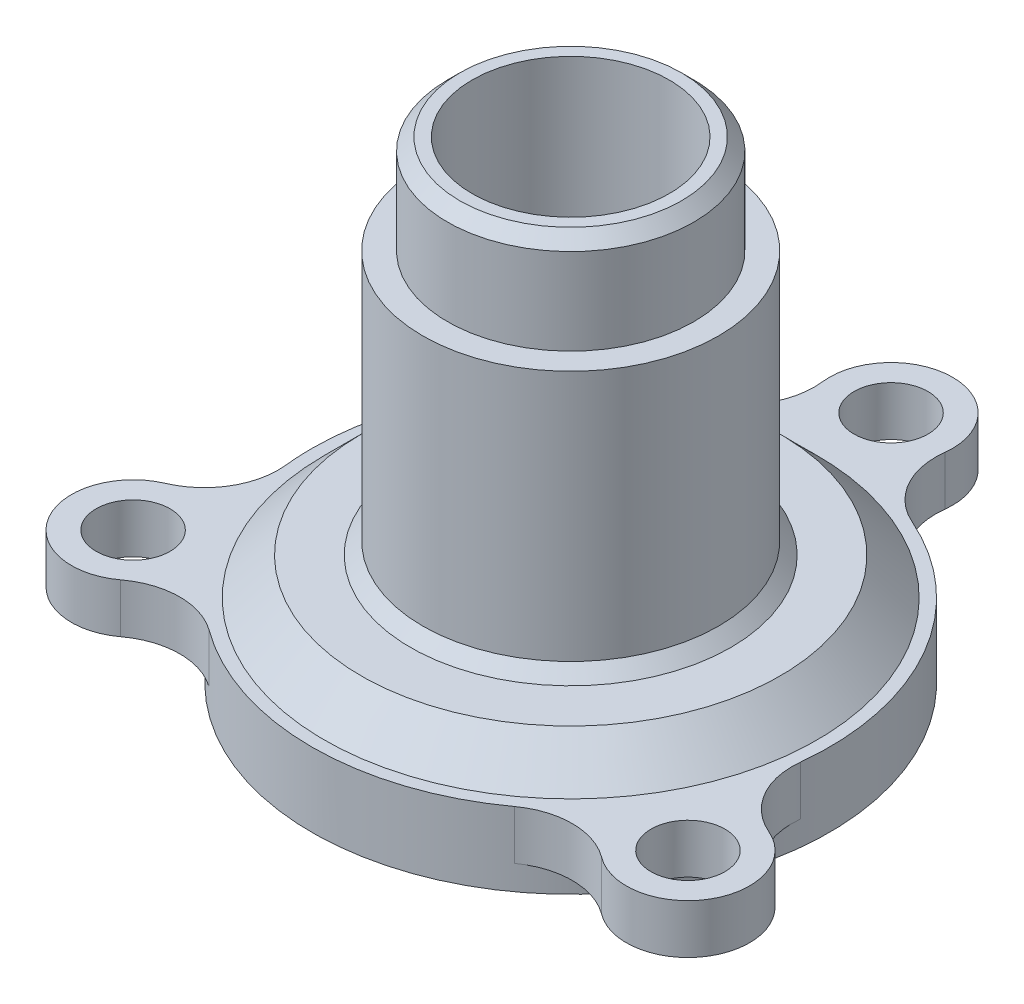
ISO-10303-21;
HEADER;
FILE_DESCRIPTION(('STEP AP214'),'2;1');
FILE_NAME('part.step','',(''),(''),'','','');
FILE_SCHEMA(('AUTOMOTIVE_DESIGN { 1 0 10303 214 1 1 1 1 }'));
ENDSEC;
DATA;
#1=APPLICATION_CONTEXT('core data for automotive mechanical design processes');
#2=APPLICATION_PROTOCOL_DEFINITION('international standard','automotive_design',2000,#1);
#3=PRODUCT_CONTEXT('',#1,'mechanical');
#4=PRODUCT('Part','Part','',(#3));
#5=PRODUCT_RELATED_PRODUCT_CATEGORY('part','',(#4));
#6=PRODUCT_DEFINITION_FORMATION('','',#4);
#7=PRODUCT_DEFINITION_CONTEXT('part definition',#1,'design');
#8=PRODUCT_DEFINITION('design','',#6,#7);
#9=PRODUCT_DEFINITION_SHAPE('','',#8);
#10=(LENGTH_UNIT() NAMED_UNIT(*) SI_UNIT(.MILLI.,.METRE.));
#11=(NAMED_UNIT(*) PLANE_ANGLE_UNIT() SI_UNIT($,.RADIAN.));
#12=(NAMED_UNIT(*) SI_UNIT($,.STERADIAN.) SOLID_ANGLE_UNIT());
#13=UNCERTAINTY_MEASURE_WITH_UNIT(LENGTH_MEASURE(1.E-05),#10,'distance_accuracy_value','');
#14=(GEOMETRIC_REPRESENTATION_CONTEXT(3) GLOBAL_UNCERTAINTY_ASSIGNED_CONTEXT((#13)) GLOBAL_UNIT_ASSIGNED_CONTEXT((#10,
#11,#12)) REPRESENTATION_CONTEXT('',''));
#15=CARTESIAN_POINT('',(0.,0.,0.));
#16=DIRECTION('',(0.,0.,1.));
#17=DIRECTION('',(1.,0.,0.));
#18=AXIS2_PLACEMENT_3D('',#15,#16,#17);
#19=CARTESIAN_POINT('',(0.,0.,0.));
#20=DIRECTION('',(0.,1.,0.));
#21=DIRECTION('',(-1.,0.,0.));
#22=AXIS2_PLACEMENT_3D('',#19,#20,#21);
#23=PLANE('',#22);
#24=CARTESIAN_POINT('',(-11.2583302491977,0.,6.50000000000001));
#25=DIRECTION('',(0.,1.,0.));
#26=DIRECTION('',(-1.,0.,0.));
#27=AXIS2_PLACEMENT_3D('',#24,#25,#26);
#28=CIRCLE('',#27,1.5);
#29=CARTESIAN_POINT('',(-12.7583302491977,0.,6.50000000000001));
#30=VERTEX_POINT('',#29);
#31=EDGE_CURVE('E464',#30,#30,#28,.T.);
#32=ORIENTED_EDGE('',*,*,#31,.T.);
#33=EDGE_LOOP('',(#32));
#34=FACE_BOUND('',#33,.T.);
#35=CARTESIAN_POINT('',(-7.96158450836959,0.,10.9024388150583));
#36=DIRECTION('',(0.,1.,0.));
#37=DIRECTION('',(-1.,0.,0.));
#38=AXIS2_PLACEMENT_3D('',#35,#36,#37);
#39=CIRCLE('',#38,3.);
#40=CARTESIAN_POINT('',(-6.19234350650969,0.,8.47967463393422));
#41=VERTEX_POINT('',#40);
#42=CARTESIAN_POINT('',(-9.7598094579122,0.,8.50110855229923));
#43=VERTEX_POINT('',#42);
#44=EDGE_CURVE('E370',#41,#43,#39,.T.);
#45=ORIENTED_EDGE('',*,*,#44,.T.);
#46=CARTESIAN_POINT('',(-11.2583302491977,0.,6.50000000000001));
#47=DIRECTION('',(0.,1.,0.));
#48=DIRECTION('',(-1.,0.,0.));
#49=AXIS2_PLACEMENT_3D('',#46,#47,#48);
#50=CIRCLE('',#49,2.5);
#51=CARTESIAN_POINT('',(-12.2420806955764,0.,4.201688650498));
#52=VERTEX_POINT('',#51);
#53=EDGE_CURVE('E458',#52,#43,#50,.T.);
#54=ORIENTED_EDGE('',*,*,#53,.F.);
#55=CARTESIAN_POINT('',(-13.4225812312308,0.,1.44371503109558));
#56=DIRECTION('',(0.,1.,0.));
#57=DIRECTION('',(-1.,0.,0.));
#58=AXIS2_PLACEMENT_3D('',#55,#56,#57);
#59=CIRCLE('',#58,3.);
#60=CARTESIAN_POINT('',(-10.4397854020684,0.,1.12288946862988));
#61=VERTEX_POINT('',#60);
#62=EDGE_CURVE('E291',#61,#52,#59,.F.);
#63=ORIENTED_EDGE('',*,*,#62,.F.);
#64=CARTESIAN_POINT('',(0.,0.,0.));
#65=DIRECTION('',(0.,1.,0.));
#66=DIRECTION('',(-1.,0.,0.));
#67=AXIS2_PLACEMENT_3D('',#64,#65,#66);
#68=CIRCLE('',#67,10.5);
#69=EDGE_CURVE('E489',#61,#41,#68,.T.);
#70=ORIENTED_EDGE('',*,*,#69,.T.);
#71=EDGE_LOOP('',(#45,#54,#63,#70));
#72=FACE_BOUND('',#71,.T.);
#73=ADVANCED_FACE('F271',(#34,#72),#23,.F.);
#74=CARTESIAN_POINT('',(11.2583302491977,0.,6.5));
#75=DIRECTION('',(0.,1.,0.));
#76=DIRECTION('',(-1.,0.,0.));
#77=AXIS2_PLACEMENT_3D('',#74,#75,#76);
#78=CIRCLE('',#77,1.5);
#79=CARTESIAN_POINT('',(9.75833024919771,0.,6.5));
#80=VERTEX_POINT('',#79);
#81=EDGE_CURVE('E467',#80,#80,#78,.T.);
#82=ORIENTED_EDGE('',*,*,#81,.T.);
#83=EDGE_LOOP('',(#82));
#84=FACE_BOUND('',#83,.T.);
#85=CARTESIAN_POINT('',(7.9615845083696,0.,10.9024388150583));
#86=DIRECTION('',(0.,1.,0.));
#87=DIRECTION('',(-1.,0.,0.));
#88=AXIS2_PLACEMENT_3D('',#85,#86,#87);
#89=CIRCLE('',#88,3.);
#90=CARTESIAN_POINT('',(6.19234350650969,0.,8.47967463393422));
#91=VERTEX_POINT('',#90);
#92=CARTESIAN_POINT('',(9.75980945791221,0.,8.50110855229922));
#93=VERTEX_POINT('',#92);
#94=EDGE_CURVE('E379',#91,#93,#89,.F.);
#95=ORIENTED_EDGE('',*,*,#94,.F.);
#96=CARTESIAN_POINT('',(10.4397854020684,0.,1.12288946862989));
#97=VERTEX_POINT('',#96);
#98=EDGE_CURVE('E493',#91,#97,#68,.T.);
#99=ORIENTED_EDGE('',*,*,#98,.T.);
#100=CARTESIAN_POINT('',(13.4225812312308,0.,1.44371503109557));
#101=DIRECTION('',(0.,1.,0.));
#102=DIRECTION('',(-1.,0.,0.));
#103=AXIS2_PLACEMENT_3D('',#100,#101,#102);
#104=CIRCLE('',#103,3.);
#105=CARTESIAN_POINT('',(12.2420806955764,0.,4.20168865049799));
#106=VERTEX_POINT('',#105);
#107=EDGE_CURVE('E419',#97,#106,#104,.T.);
#108=ORIENTED_EDGE('',*,*,#107,.T.);
#109=CARTESIAN_POINT('',(11.2583302491977,0.,6.5));
#110=DIRECTION('',(0.,1.,0.));
#111=DIRECTION('',(-1.,0.,0.));
#112=AXIS2_PLACEMENT_3D('',#109,#110,#111);
#113=CIRCLE('',#112,2.5);
#114=EDGE_CURVE('E422',#93,#106,#113,.T.);
#115=ORIENTED_EDGE('',*,*,#114,.F.);
#116=EDGE_LOOP('',(#95,#99,#108,#115));
#117=FACE_BOUND('',#116,.T.);
#118=ADVANCED_FACE('F530',(#84,#117),#23,.F.);
#119=CARTESIAN_POINT('',(0.,2.,0.));
#120=DIRECTION('',(0.,-1.,0.));
#121=DIRECTION('',(1.,0.,0.));
#122=AXIS2_PLACEMENT_3D('',#119,#120,#121);
#123=PLANE('',#122);
#124=CARTESIAN_POINT('',(11.2583302491977,2.,6.5));
#125=DIRECTION('',(0.,1.,0.));
#126=DIRECTION('',(0.,0.,1.));
#127=AXIS2_PLACEMENT_3D('',#124,#125,#126);
#128=CIRCLE('',#127,1.5);
#129=CARTESIAN_POINT('',(11.2583302491977,2.,8.));
#130=VERTEX_POINT('',#129);
#131=EDGE_CURVE('E424',#130,#130,#128,.T.);
#132=ORIENTED_EDGE('',*,*,#131,.F.);
#133=EDGE_LOOP('',(#132));
#134=FACE_BOUND('',#133,.T.);
#135=CARTESIAN_POINT('',(-11.2583302491977,2.,6.50000000000001));
#136=DIRECTION('',(0.,1.,0.));
#137=DIRECTION('',(0.,0.,1.));
#138=AXIS2_PLACEMENT_3D('',#135,#136,#137);
#139=CIRCLE('',#138,1.5);
#140=CARTESIAN_POINT('',(-11.2583302491977,2.,8.00000000000001));
#141=VERTEX_POINT('',#140);
#142=EDGE_CURVE('E428',#141,#141,#139,.T.);
#143=ORIENTED_EDGE('',*,*,#142,.F.);
#144=EDGE_LOOP('',(#143));
#145=FACE_BOUND('',#144,.T.);
#146=CARTESIAN_POINT('',(0.,2.,-13.));
#147=DIRECTION('',(0.,1.,0.));
#148=DIRECTION('',(0.,0.,1.));
#149=AXIS2_PLACEMENT_3D('',#146,#147,#148);
#150=CIRCLE('',#149,1.5);
#151=CARTESIAN_POINT('',(0.,2.,-11.5));
#152=VERTEX_POINT('',#151);
#153=EDGE_CURVE('E425',#152,#152,#150,.T.);
#154=ORIENTED_EDGE('',*,*,#153,.F.);
#155=EDGE_LOOP('',(#154));
#156=FACE_BOUND('',#155,.T.);
#157=CARTESIAN_POINT('',(0.,2.,0.));
#158=DIRECTION('',(0.,1.,0.));
#159=DIRECTION('',(-1.,0.,0.));
#160=AXIS2_PLACEMENT_3D('',#157,#158,#159);
#161=CIRCLE('',#160,10.);
#162=CARTESIAN_POINT('',(-10.,2.,0.));
#163=VERTEX_POINT('',#162);
#164=EDGE_CURVE('E485',#163,#163,#161,.T.);
#165=ORIENTED_EDGE('',*,*,#164,.F.);
#166=EDGE_LOOP('',(#165));
#167=FACE_BOUND('',#166,.T.);
#168=CARTESIAN_POINT('',(-11.2583302491977,2.,6.50000000000001));
#169=DIRECTION('',(0.,1.,0.));
#170=DIRECTION('',(0.,0.,1.));
#171=AXIS2_PLACEMENT_3D('',#168,#169,#170);
#172=CIRCLE('',#171,2.5);
#173=CARTESIAN_POINT('',(-12.2420806955764,2.,4.201688650498));
#174=VERTEX_POINT('',#173);
#175=CARTESIAN_POINT('',(-9.7598094579122,2.,8.50110855229923));
#176=VERTEX_POINT('',#175);
#177=EDGE_CURVE('E443',#174,#176,#172,.T.);
#178=ORIENTED_EDGE('',*,*,#177,.T.);
#179=CARTESIAN_POINT('',(-7.96158450836959,2.,10.9024388150583));
#180=DIRECTION('',(0.,1.,0.));
#181=DIRECTION('',(0.,0.,1.));
#182=AXIS2_PLACEMENT_3D('',#179,#180,#181);
#183=CIRCLE('',#182,3.);
#184=CARTESIAN_POINT('',(-6.19234350650969,2.,8.47967463393422));
#185=VERTEX_POINT('',#184);
#186=EDGE_CURVE('E381',#185,#176,#183,.T.);
#187=ORIENTED_EDGE('',*,*,#186,.F.);
#188=CARTESIAN_POINT('',(0.,2.,0.));
#189=DIRECTION('',(0.,1.,0.));
#190=DIRECTION('',(0.,0.,1.));
#191=AXIS2_PLACEMENT_3D('',#188,#189,#190);
#192=CIRCLE('',#191,10.5);
#193=CARTESIAN_POINT('',(6.19234350650969,2.,8.47967463393422));
#194=VERTEX_POINT('',#193);
#195=EDGE_CURVE('E386',#185,#194,#192,.T.);
#196=ORIENTED_EDGE('',*,*,#195,.T.);
#197=CARTESIAN_POINT('',(7.9615845083696,2.,10.9024388150583));
#198=DIRECTION('',(0.,1.,0.));
#199=DIRECTION('',(0.,0.,1.));
#200=AXIS2_PLACEMENT_3D('',#197,#198,#199);
#201=CIRCLE('',#200,3.);
#202=CARTESIAN_POINT('',(9.75980945791221,2.,8.50110855229922));
#203=VERTEX_POINT('',#202);
#204=EDGE_CURVE('E376',#194,#203,#201,.F.);
#205=ORIENTED_EDGE('',*,*,#204,.T.);
#206=CARTESIAN_POINT('',(11.2583302491977,2.,6.5));
#207=DIRECTION('',(0.,1.,0.));
#208=DIRECTION('',(0.,0.,1.));
#209=AXIS2_PLACEMENT_3D('',#206,#207,#208);
#210=CIRCLE('',#209,2.5);
#211=CARTESIAN_POINT('',(12.2420806955764,2.,4.20168865049799));
#212=VERTEX_POINT('',#211);
#213=EDGE_CURVE('E359',#203,#212,#210,.T.);
#214=ORIENTED_EDGE('',*,*,#213,.T.);
#215=CARTESIAN_POINT('',(13.4225812312308,2.,1.44371503109557));
#216=DIRECTION('',(0.,1.,0.));
#217=DIRECTION('',(0.,0.,1.));
#218=AXIS2_PLACEMENT_3D('',#215,#216,#217);
#219=CIRCLE('',#218,3.);
#220=CARTESIAN_POINT('',(10.4397854020684,2.,1.12288946862989));
#221=VERTEX_POINT('',#220);
#222=EDGE_CURVE('E406',#221,#212,#219,.T.);
#223=ORIENTED_EDGE('',*,*,#222,.F.);
#224=CARTESIAN_POINT('',(0.,2.,0.));
#225=DIRECTION('',(0.,1.,0.));
#226=DIRECTION('',(0.,0.,1.));
#227=AXIS2_PLACEMENT_3D('',#224,#225,#226);
#228=CIRCLE('',#227,10.5);
#229=CARTESIAN_POINT('',(4.2474418955587,2.,-9.60256410256411));
#230=VERTEX_POINT('',#229);
#231=EDGE_CURVE('E403',#221,#230,#228,.T.);
#232=ORIENTED_EDGE('',*,*,#231,.T.);
#233=CARTESIAN_POINT('',(5.46099672286118,2.,-12.3461538461539));
#234=DIRECTION('',(0.,1.,0.));
#235=DIRECTION('',(0.,0.,1.));
#236=AXIS2_PLACEMENT_3D('',#233,#234,#235);
#237=CIRCLE('',#236,3.);
#238=CARTESIAN_POINT('',(2.48227123766417,2.,-12.7027972027972));
#239=VERTEX_POINT('',#238);
#240=EDGE_CURVE('E369',#230,#239,#237,.F.);
#241=ORIENTED_EDGE('',*,*,#240,.T.);
#242=CARTESIAN_POINT('',(0.,2.,-13.));
#243=DIRECTION('',(0.,1.,0.));
#244=DIRECTION('',(0.,0.,1.));
#245=AXIS2_PLACEMENT_3D('',#242,#243,#244);
#246=CIRCLE('',#245,2.5);
#247=CARTESIAN_POINT('',(-2.48227123766417,2.,-12.7027972027972));
#248=VERTEX_POINT('',#247);
#249=EDGE_CURVE('E440',#239,#248,#246,.T.);
#250=ORIENTED_EDGE('',*,*,#249,.T.);
#251=CARTESIAN_POINT('',(-5.46099672286118,2.,-12.3461538461539));
#252=DIRECTION('',(0.,1.,0.));
#253=DIRECTION('',(0.,0.,1.));
#254=AXIS2_PLACEMENT_3D('',#251,#252,#253);
#255=CIRCLE('',#254,3.);
#256=CARTESIAN_POINT('',(-4.2474418955587,2.,-9.60256410256411));
#257=VERTEX_POINT('',#256);
#258=EDGE_CURVE('E437',#257,#248,#255,.T.);
#259=ORIENTED_EDGE('',*,*,#258,.F.);
#260=CARTESIAN_POINT('',(0.,2.,0.));
#261=DIRECTION('',(0.,1.,0.));
#262=DIRECTION('',(0.,0.,1.));
#263=AXIS2_PLACEMENT_3D('',#260,#261,#262);
#264=CIRCLE('',#263,10.5);
#265=CARTESIAN_POINT('',(-10.4397854020684,2.,1.12288946862988));
#266=VERTEX_POINT('',#265);
#267=EDGE_CURVE('E434',#257,#266,#264,.T.);
#268=ORIENTED_EDGE('',*,*,#267,.T.);
#269=CARTESIAN_POINT('',(-13.4225812312308,2.,1.44371503109558));
#270=DIRECTION('',(0.,1.,0.));
#271=DIRECTION('',(0.,0.,1.));
#272=AXIS2_PLACEMENT_3D('',#269,#270,#271);
#273=CIRCLE('',#272,3.);
#274=EDGE_CURVE('E286',#266,#174,#273,.F.);
#275=ORIENTED_EDGE('',*,*,#274,.T.);
#276=EDGE_LOOP('',(#178,#187,#196,#205,#214,#223,#232,#241,#250,#259,#268,#275));
#277=FACE_BOUND('',#276,.T.);
#278=ADVANCED_FACE('F383',(#134,#145,#156,#167,#277),#123,.F.);
#279=CARTESIAN_POINT('',(0.,0.,-13.));
#280=DIRECTION('',(0.,1.,0.));
#281=DIRECTION('',(-1.,0.,0.));
#282=AXIS2_PLACEMENT_3D('',#279,#280,#281);
#283=CIRCLE('',#282,1.5);
#284=CARTESIAN_POINT('',(-1.5,0.,-13.));
#285=VERTEX_POINT('',#284);
#286=EDGE_CURVE('E461',#285,#285,#283,.T.);
#287=ORIENTED_EDGE('',*,*,#286,.T.);
#288=EDGE_LOOP('',(#287));
#289=FACE_BOUND('',#288,.T.);
#290=CARTESIAN_POINT('',(5.46099672286118,0.,-12.3461538461539));
#291=DIRECTION('',(0.,1.,0.));
#292=DIRECTION('',(-1.,0.,0.));
#293=AXIS2_PLACEMENT_3D('',#290,#291,#292);
#294=CIRCLE('',#293,3.);
#295=CARTESIAN_POINT('',(4.2474418955587,0.,-9.60256410256411));
#296=VERTEX_POINT('',#295);
#297=CARTESIAN_POINT('',(2.48227123766417,0.,-12.7027972027972));
#298=VERTEX_POINT('',#297);
#299=EDGE_CURVE('E410',#296,#298,#294,.F.);
#300=ORIENTED_EDGE('',*,*,#299,.F.);
#301=CARTESIAN_POINT('',(-4.2474418955587,0.,-9.60256410256411));
#302=VERTEX_POINT('',#301);
#303=EDGE_CURVE('E488',#296,#302,#68,.T.);
#304=ORIENTED_EDGE('',*,*,#303,.T.);
#305=CARTESIAN_POINT('',(-5.46099672286118,0.,-12.3461538461539));
#306=DIRECTION('',(0.,1.,0.));
#307=DIRECTION('',(-1.,0.,0.));
#308=AXIS2_PLACEMENT_3D('',#305,#306,#307);
#309=CIRCLE('',#308,3.);
#310=CARTESIAN_POINT('',(-2.48227123766417,0.,-12.7027972027972));
#311=VERTEX_POINT('',#310);
#312=EDGE_CURVE('E448',#302,#311,#309,.T.);
#313=ORIENTED_EDGE('',*,*,#312,.T.);
#314=CARTESIAN_POINT('',(0.,0.,-13.));
#315=DIRECTION('',(0.,1.,0.));
#316=DIRECTION('',(-1.,0.,0.));
#317=AXIS2_PLACEMENT_3D('',#314,#315,#316);
#318=CIRCLE('',#317,2.5);
#319=EDGE_CURVE('E456',#298,#311,#318,.T.);
#320=ORIENTED_EDGE('',*,*,#319,.F.);
#321=EDGE_LOOP('',(#300,#304,#313,#320));
#322=FACE_BOUND('',#321,.T.);
#323=ADVANCED_FACE('F533',(#289,#322),#23,.F.);
#324=CARTESIAN_POINT('',(0.,1.5,0.));
#325=DIRECTION('',(0.,-1.,0.));
#326=DIRECTION('',(1.,0.,0.));
#327=AXIS2_PLACEMENT_3D('',#324,#325,#326);
#328=PLANE('',#327);
#329=CARTESIAN_POINT('',(0.,1.5,0.));
#330=DIRECTION('',(0.,1.,0.));
#331=DIRECTION('',(-1.,0.,0.));
#332=AXIS2_PLACEMENT_3D('',#329,#330,#331);
#333=CIRCLE('',#332,4.);
#334=CARTESIAN_POINT('',(-4.,1.5,0.));
#335=VERTEX_POINT('',#334);
#336=EDGE_CURVE('E470',#335,#335,#333,.T.);
#337=ORIENTED_EDGE('',*,*,#336,.T.);
#338=EDGE_LOOP('',(#337));
#339=FACE_BOUND('',#338,.T.);
#340=CARTESIAN_POINT('',(0.,1.5,0.));
#341=DIRECTION('',(0.,1.,0.));
#342=DIRECTION('',(-1.,0.,0.));
#343=AXIS2_PLACEMENT_3D('',#340,#341,#342);
#344=CIRCLE('',#343,8.5);
#345=CARTESIAN_POINT('',(-8.5,1.5,0.));
#346=VERTEX_POINT('',#345);
#347=EDGE_CURVE('E502',#346,#346,#344,.T.);
#348=ORIENTED_EDGE('',*,*,#347,.F.);
#349=EDGE_LOOP('',(#348));
#350=FACE_BOUND('',#349,.T.);
#351=ADVANCED_FACE('F542',(#339,#350),#328,.T.);
#352=CARTESIAN_POINT('',(0.,1.5,0.));
#353=DIRECTION('',(0.,-1.,0.));
#354=DIRECTION('',(1.,0.,0.));
#355=AXIS2_PLACEMENT_3D('',#352,#353,#354);
#356=CONICAL_SURFACE('',#355,8.5,0.78539816339745);
#357=CARTESIAN_POINT('',(0.,0.5,0.));
#358=DIRECTION('',(0.,1.,0.));
#359=DIRECTION('',(-1.,0.,0.));
#360=AXIS2_PLACEMENT_3D('',#357,#358,#359);
#361=CIRCLE('',#360,9.50000000000001);
#362=CARTESIAN_POINT('',(-9.50000000000001,0.5,0.));
#363=VERTEX_POINT('',#362);
#364=EDGE_CURVE('E499',#363,#363,#361,.T.);
#365=ORIENTED_EDGE('',*,*,#364,.F.);
#366=EDGE_LOOP('',(#365));
#367=FACE_BOUND('',#366,.T.);
#368=ORIENTED_EDGE('',*,*,#347,.T.);
#369=EDGE_LOOP('',(#368));
#370=FACE_BOUND('',#369,.T.);
#371=ADVANCED_FACE('F548',(#367,#370),#356,.F.);
#372=CARTESIAN_POINT('',(0.,18.9,0.));
#373=DIRECTION('',(0.,1.,0.));
#374=DIRECTION('',(-1.,0.,0.));
#375=AXIS2_PLACEMENT_3D('',#372,#373,#374);
#376=CYLINDRICAL_SURFACE('',#375,9.50000000000001);
#377=ORIENTED_EDGE('',*,*,#364,.T.);
#378=EDGE_LOOP('',(#377));
#379=FACE_BOUND('',#378,.T.);
#380=CARTESIAN_POINT('',(0.,-1.,0.));
#381=DIRECTION('',(0.,1.,0.));
#382=DIRECTION('',(-1.,0.,0.));
#383=AXIS2_PLACEMENT_3D('',#380,#381,#382);
#384=CIRCLE('',#383,9.50000000000001);
#385=CARTESIAN_POINT('',(-9.50000000000001,-1.,0.));
#386=VERTEX_POINT('',#385);
#387=EDGE_CURVE('E496',#386,#386,#384,.T.);
#388=ORIENTED_EDGE('',*,*,#387,.F.);
#389=EDGE_LOOP('',(#388));
#390=FACE_BOUND('',#389,.T.);
#391=ADVANCED_FACE('F654',(#379,#390),#376,.F.);
#392=CARTESIAN_POINT('',(0.,-1.,0.));
#393=DIRECTION('',(0.,-1.,0.));
#394=DIRECTION('',(1.,0.,0.));
#395=AXIS2_PLACEMENT_3D('',#392,#393,#394);
#396=PLANE('',#395);
#397=ORIENTED_EDGE('',*,*,#387,.T.);
#398=EDGE_LOOP('',(#397));
#399=FACE_BOUND('',#398,.T.);
#400=CARTESIAN_POINT('',(0.,-1.,0.));
#401=DIRECTION('',(0.,1.,0.));
#402=DIRECTION('',(-1.,0.,0.));
#403=AXIS2_PLACEMENT_3D('',#400,#401,#402);
#404=CIRCLE('',#403,10.5);
#405=CARTESIAN_POINT('',(-10.5,-1.,0.));
#406=VERTEX_POINT('',#405);
#407=EDGE_CURVE('E492',#406,#406,#404,.T.);
#408=ORIENTED_EDGE('',*,*,#407,.F.);
#409=EDGE_LOOP('',(#408));
#410=FACE_BOUND('',#409,.T.);
#411=ADVANCED_FACE('F645',(#399,#410),#396,.T.);
#412=CARTESIAN_POINT('',(0.,18.9,0.));
#413=DIRECTION('',(0.,1.,0.));
#414=DIRECTION('',(-1.,0.,0.));
#415=AXIS2_PLACEMENT_3D('',#412,#413,#414);
#416=CYLINDRICAL_SURFACE('',#415,10.5);
#417=ORIENTED_EDGE('',*,*,#98,.F.);
#418=DIRECTION('',(0.,1.,0.));
#419=VECTOR('',#418,1.);
#420=CARTESIAN_POINT('',(6.19234350650969,-1.,8.47967463393422));
#421=LINE('',#420,#419);
#422=EDGE_CURVE('E380',#91,#194,#421,.T.);
#423=ORIENTED_EDGE('',*,*,#422,.T.);
#424=ORIENTED_EDGE('',*,*,#195,.F.);
#425=DIRECTION('',(0.,1.,0.));
#426=VECTOR('',#425,1.);
#427=CARTESIAN_POINT('',(-6.19234350650969,-1.,8.47967463393422));
#428=LINE('',#427,#426);
#429=EDGE_CURVE('E395',#41,#185,#428,.T.);
#430=ORIENTED_EDGE('',*,*,#429,.F.);
#431=ORIENTED_EDGE('',*,*,#69,.F.);
#432=DIRECTION('',(0.,1.,0.));
#433=VECTOR('',#432,1.);
#434=CARTESIAN_POINT('',(-10.4397854020684,-1.,1.12288946862988));
#435=LINE('',#434,#433);
#436=EDGE_CURVE('E445',#61,#266,#435,.T.);
#437=ORIENTED_EDGE('',*,*,#436,.T.);
#438=ORIENTED_EDGE('',*,*,#267,.F.);
#439=DIRECTION('',(0.,1.,0.));
#440=VECTOR('',#439,1.);
#441=CARTESIAN_POINT('',(-4.2474418955587,-1.,-9.60256410256411));
#442=LINE('',#441,#440);
#443=EDGE_CURVE('E451',#302,#257,#442,.T.);
#444=ORIENTED_EDGE('',*,*,#443,.F.);
#445=ORIENTED_EDGE('',*,*,#303,.F.);
#446=DIRECTION('',(0.,1.,0.));
#447=VECTOR('',#446,1.);
#448=CARTESIAN_POINT('',(4.2474418955587,-1.,-9.60256410256411));
#449=LINE('',#448,#447);
#450=EDGE_CURVE('E413',#296,#230,#449,.T.);
#451=ORIENTED_EDGE('',*,*,#450,.T.);
#452=ORIENTED_EDGE('',*,*,#231,.F.);
#453=DIRECTION('',(0.,1.,0.));
#454=VECTOR('',#453,1.);
#455=CARTESIAN_POINT('',(10.4397854020684,-1.,1.12288946862989));
#456=LINE('',#455,#454);
#457=EDGE_CURVE('E411',#97,#221,#456,.T.);
#458=ORIENTED_EDGE('',*,*,#457,.F.);
#459=EDGE_LOOP('',(#417,#423,#424,#430,#431,#437,#438,#444,#445,#451,#452,#458));
#460=FACE_BOUND('',#459,.T.);
#461=ORIENTED_EDGE('',*,*,#407,.T.);
#462=EDGE_LOOP('',(#461));
#463=FACE_BOUND('',#462,.T.);
#464=ADVANCED_FACE('F562',(#460,#463),#416,.T.);
#465=CARTESIAN_POINT('',(0.,3.5,0.));
#466=DIRECTION('',(0.,-1.,0.));
#467=DIRECTION('',(1.,0.,0.));
#468=AXIS2_PLACEMENT_3D('',#465,#466,#467);
#469=CONICAL_SURFACE('',#468,8.50000000000001,0.785398163397447);
#470=ORIENTED_EDGE('',*,*,#164,.T.);
#471=EDGE_LOOP('',(#470));
#472=FACE_BOUND('',#471,.T.);
#473=CARTESIAN_POINT('',(0.,3.5,0.));
#474=DIRECTION('',(0.,1.,0.));
#475=DIRECTION('',(-1.,0.,0.));
#476=AXIS2_PLACEMENT_3D('',#473,#474,#475);
#477=CIRCLE('',#476,8.50000000000001);
#478=CARTESIAN_POINT('',(-8.50000000000001,3.5,0.));
#479=VERTEX_POINT('',#478);
#480=EDGE_CURVE('E482',#479,#479,#477,.T.);
#481=ORIENTED_EDGE('',*,*,#480,.F.);
#482=EDGE_LOOP('',(#481));
#483=FACE_BOUND('',#482,.T.);
#484=ADVANCED_FACE('F638',(#472,#483),#469,.T.);
#485=CARTESIAN_POINT('',(0.,3.5,0.));
#486=DIRECTION('',(0.,1.,0.));
#487=DIRECTION('',(-1.,0.,0.));
#488=AXIS2_PLACEMENT_3D('',#485,#486,#487);
#489=PLANE('',#488);
#490=CARTESIAN_POINT('',(0.,3.5,0.));
#491=DIRECTION('',(0.,1.,0.));
#492=DIRECTION('',(-1.,0.,0.));
#493=AXIS2_PLACEMENT_3D('',#490,#491,#492);
#494=CIRCLE('',#493,6.49999999999999);
#495=CARTESIAN_POINT('',(-6.49999999999999,3.5,0.));
#496=VERTEX_POINT('',#495);
#497=EDGE_CURVE('E508',#496,#496,#494,.F.);
#498=ORIENTED_EDGE('',*,*,#497,.T.);
#499=EDGE_LOOP('',(#498));
#500=FACE_BOUND('',#499,.T.);
#501=ORIENTED_EDGE('',*,*,#480,.T.);
#502=EDGE_LOOP('',(#501));
#503=FACE_BOUND('',#502,.T.);
#504=ADVANCED_FACE('F634',(#500,#503),#489,.T.);
#505=CARTESIAN_POINT('',(0.,18.9,0.));
#506=DIRECTION('',(0.,1.,0.));
#507=DIRECTION('',(-1.,0.,0.));
#508=AXIS2_PLACEMENT_3D('',#505,#506,#507);
#509=CYLINDRICAL_SURFACE('',#508,6.);
#510=CARTESIAN_POINT('',(0.,4.,0.));
#511=DIRECTION('',(0.,1.,0.));
#512=DIRECTION('',(-1.,0.,0.));
#513=AXIS2_PLACEMENT_3D('',#510,#511,#512);
#514=CIRCLE('',#513,6.);
#515=CARTESIAN_POINT('',(-6.,4.,0.));
#516=VERTEX_POINT('',#515);
#517=EDGE_CURVE('E505',#516,#516,#514,.T.);
#518=ORIENTED_EDGE('',*,*,#517,.T.);
#519=EDGE_LOOP('',(#518));
#520=FACE_BOUND('',#519,.T.);
#521=CARTESIAN_POINT('',(0.,14.2,0.));
#522=DIRECTION('',(0.,1.,0.));
#523=DIRECTION('',(-1.,0.,0.));
#524=AXIS2_PLACEMENT_3D('',#521,#522,#523);
#525=CIRCLE('',#524,6.);
#526=CARTESIAN_POINT('',(-6.,14.2,0.));
#527=VERTEX_POINT('',#526);
#528=EDGE_CURVE('E479',#527,#527,#525,.T.);
#529=ORIENTED_EDGE('',*,*,#528,.F.);
#530=EDGE_LOOP('',(#529));
#531=FACE_BOUND('',#530,.T.);
#532=ADVANCED_FACE('F630',(#520,#531),#509,.T.);
#533=CARTESIAN_POINT('',(0.,14.2,0.));
#534=DIRECTION('',(0.,1.,0.));
#535=DIRECTION('',(-1.,0.,0.));
#536=AXIS2_PLACEMENT_3D('',#533,#534,#535);
#537=PLANE('',#536);
#538=ORIENTED_EDGE('',*,*,#528,.T.);
#539=EDGE_LOOP('',(#538));
#540=FACE_BOUND('',#539,.T.);
#541=CARTESIAN_POINT('',(0.,14.2,0.));
#542=DIRECTION('',(0.,1.,0.));
#543=DIRECTION('',(-1.,0.,0.));
#544=AXIS2_PLACEMENT_3D('',#541,#542,#543);
#545=CIRCLE('',#544,5.);
#546=CARTESIAN_POINT('',(-5.,14.2,0.));
#547=VERTEX_POINT('',#546);
#548=EDGE_CURVE('E476',#547,#547,#545,.T.);
#549=ORIENTED_EDGE('',*,*,#548,.F.);
#550=EDGE_LOOP('',(#549));
#551=FACE_BOUND('',#550,.T.);
#552=ADVANCED_FACE('F626',(#540,#551),#537,.T.);
#553=CARTESIAN_POINT('',(0.,18.9,0.));
#554=DIRECTION('',(0.,1.,0.));
#555=DIRECTION('',(-1.,0.,0.));
#556=AXIS2_PLACEMENT_3D('',#553,#554,#555);
#557=CYLINDRICAL_SURFACE('',#556,5.);
#558=CARTESIAN_POINT('',(0.,17.7,0.));
#559=DIRECTION('',(0.,1.,0.));
#560=DIRECTION('',(-1.,0.,0.));
#561=AXIS2_PLACEMENT_3D('',#558,#559,#560);
#562=CIRCLE('',#561,5.);
#563=CARTESIAN_POINT('',(-5.,17.7,0.));
#564=VERTEX_POINT('',#563);
#565=EDGE_CURVE('E12',#564,#564,#562,.F.);
#566=ORIENTED_EDGE('',*,*,#565,.T.);
#567=EDGE_LOOP('',(#566));
#568=FACE_BOUND('',#567,.T.);
#569=ORIENTED_EDGE('',*,*,#548,.T.);
#570=EDGE_LOOP('',(#569));
#571=FACE_BOUND('',#570,.T.);
#572=ADVANCED_FACE('F623',(#568,#571),#557,.T.);
#573=CARTESIAN_POINT('',(0.,18.2,0.));
#574=DIRECTION('',(0.,1.,0.));
#575=DIRECTION('',(-1.,0.,0.));
#576=AXIS2_PLACEMENT_3D('',#573,#574,#575);
#577=PLANE('',#576);
#578=CARTESIAN_POINT('',(0.,18.2,0.));
#579=DIRECTION('',(0.,1.,0.));
#580=DIRECTION('',(-1.,0.,0.));
#581=AXIS2_PLACEMENT_3D('',#578,#579,#580);
#582=CIRCLE('',#581,4.49999999999999);
#583=CARTESIAN_POINT('',(-4.49999999999999,18.2,0.));
#584=VERTEX_POINT('',#583);
#585=EDGE_CURVE('E279',#584,#584,#582,.T.);
#586=ORIENTED_EDGE('',*,*,#585,.T.);
#587=EDGE_LOOP('',(#586));
#588=FACE_BOUND('',#587,.T.);
#589=CARTESIAN_POINT('',(0.,18.2,0.));
#590=DIRECTION('',(0.,1.,0.));
#591=DIRECTION('',(-1.,0.,0.));
#592=AXIS2_PLACEMENT_3D('',#589,#590,#591);
#593=CIRCLE('',#592,4.);
#594=CARTESIAN_POINT('',(-4.,18.2,0.));
#595=VERTEX_POINT('',#594);
#596=EDGE_CURVE('E473',#595,#595,#593,.T.);
#597=ORIENTED_EDGE('',*,*,#596,.F.);
#598=EDGE_LOOP('',(#597));
#599=FACE_BOUND('',#598,.T.);
#600=ADVANCED_FACE('F513',(#588,#599),#577,.T.);
#601=CARTESIAN_POINT('',(0.,18.9,0.));
#602=DIRECTION('',(0.,1.,0.));
#603=DIRECTION('',(-1.,0.,0.));
#604=AXIS2_PLACEMENT_3D('',#601,#602,#603);
#605=CYLINDRICAL_SURFACE('',#604,4.);
#606=ORIENTED_EDGE('',*,*,#336,.F.);
#607=EDGE_LOOP('',(#606));
#608=FACE_BOUND('',#607,.T.);
#609=ORIENTED_EDGE('',*,*,#596,.T.);
#610=EDGE_LOOP('',(#609));
#611=FACE_BOUND('',#610,.T.);
#612=ADVANCED_FACE('F526',(#608,#611),#605,.F.);
#613=CARTESIAN_POINT('',(0.,4.,0.));
#614=DIRECTION('',(0.,-1.,0.));
#615=DIRECTION('',(1.,0.,0.));
#616=AXIS2_PLACEMENT_3D('',#613,#614,#615);
#617=CONICAL_SURFACE('',#616,6.,0.785398163397441);
#618=ORIENTED_EDGE('',*,*,#497,.F.);
#619=EDGE_LOOP('',(#618));
#620=FACE_BOUND('',#619,.T.);
#621=ORIENTED_EDGE('',*,*,#517,.F.);
#622=EDGE_LOOP('',(#621));
#623=FACE_BOUND('',#622,.T.);
#624=ADVANCED_FACE('F518',(#620,#623),#617,.T.);
#625=CARTESIAN_POINT('',(0.,18.2,0.));
#626=DIRECTION('',(0.,-1.,0.));
#627=DIRECTION('',(1.,0.,0.));
#628=AXIS2_PLACEMENT_3D('',#625,#626,#627);
#629=CONICAL_SURFACE('',#628,4.49999999999999,0.785398163397445);
#630=ORIENTED_EDGE('',*,*,#565,.F.);
#631=EDGE_LOOP('',(#630));
#632=FACE_BOUND('',#631,.T.);
#633=ORIENTED_EDGE('',*,*,#585,.F.);
#634=EDGE_LOOP('',(#633));
#635=FACE_BOUND('',#634,.T.);
#636=ADVANCED_FACE('F273',(#632,#635),#629,.T.);
#637=CARTESIAN_POINT('',(-13.4225812312308,-1.,1.44371503109558));
#638=DIRECTION('',(0.,1.,0.));
#639=DIRECTION('',(0.,0.,1.));
#640=AXIS2_PLACEMENT_3D('',#637,#638,#639);
#641=CYLINDRICAL_SURFACE('',#640,3.);
#642=ORIENTED_EDGE('',*,*,#62,.T.);
#643=DIRECTION('',(0.,1.,0.));
#644=VECTOR('',#643,1.);
#645=CARTESIAN_POINT('',(-12.2420806955764,-1.,4.201688650498));
#646=LINE('',#645,#644);
#647=EDGE_CURVE('E446',#52,#174,#646,.T.);
#648=ORIENTED_EDGE('',*,*,#647,.T.);
#649=ORIENTED_EDGE('',*,*,#274,.F.);
#650=ORIENTED_EDGE('',*,*,#436,.F.);
#651=EDGE_LOOP('',(#642,#648,#649,#650));
#652=FACE_BOUND('',#651,.T.);
#653=ADVANCED_FACE('F517',(#652),#641,.F.);
#654=CARTESIAN_POINT('',(-11.2583302491977,-1.,6.50000000000001));
#655=DIRECTION('',(0.,1.,0.));
#656=DIRECTION('',(0.,0.,1.));
#657=AXIS2_PLACEMENT_3D('',#654,#655,#656);
#658=CYLINDRICAL_SURFACE('',#657,2.5);
#659=ORIENTED_EDGE('',*,*,#53,.T.);
#660=DIRECTION('',(0.,1.,0.));
#661=VECTOR('',#660,1.);
#662=CARTESIAN_POINT('',(-9.7598094579122,-1.,8.50110855229923));
#663=LINE('',#662,#661);
#664=EDGE_CURVE('E392',#43,#176,#663,.T.);
#665=ORIENTED_EDGE('',*,*,#664,.T.);
#666=ORIENTED_EDGE('',*,*,#177,.F.);
#667=ORIENTED_EDGE('',*,*,#647,.F.);
#668=EDGE_LOOP('',(#659,#665,#666,#667));
#669=FACE_BOUND('',#668,.T.);
#670=ADVANCED_FACE('F524',(#669),#658,.T.);
#671=CARTESIAN_POINT('',(0.,-1.,-13.));
#672=DIRECTION('',(0.,1.,0.));
#673=DIRECTION('',(0.,0.,1.));
#674=AXIS2_PLACEMENT_3D('',#671,#672,#673);
#675=CYLINDRICAL_SURFACE('',#674,2.5);
#676=ORIENTED_EDGE('',*,*,#319,.T.);
#677=DIRECTION('',(0.,1.,0.));
#678=VECTOR('',#677,1.);
#679=CARTESIAN_POINT('',(-2.48227123766417,-1.,-12.7027972027972));
#680=LINE('',#679,#678);
#681=EDGE_CURVE('E449',#311,#248,#680,.T.);
#682=ORIENTED_EDGE('',*,*,#681,.T.);
#683=ORIENTED_EDGE('',*,*,#249,.F.);
#684=DIRECTION('',(0.,1.,0.));
#685=VECTOR('',#684,1.);
#686=CARTESIAN_POINT('',(2.48227123766417,-1.,-12.7027972027972));
#687=LINE('',#686,#685);
#688=EDGE_CURVE('E408',#298,#239,#687,.T.);
#689=ORIENTED_EDGE('',*,*,#688,.F.);
#690=EDGE_LOOP('',(#676,#682,#683,#689));
#691=FACE_BOUND('',#690,.T.);
#692=ADVANCED_FACE('F575',(#691),#675,.T.);
#693=CARTESIAN_POINT('',(-5.46099672286118,-1.,-12.3461538461539));
#694=DIRECTION('',(0.,1.,0.));
#695=DIRECTION('',(0.,0.,1.));
#696=AXIS2_PLACEMENT_3D('',#693,#694,#695);
#697=CYLINDRICAL_SURFACE('',#696,3.);
#698=ORIENTED_EDGE('',*,*,#443,.T.);
#699=ORIENTED_EDGE('',*,*,#258,.T.);
#700=ORIENTED_EDGE('',*,*,#681,.F.);
#701=ORIENTED_EDGE('',*,*,#312,.F.);
#702=EDGE_LOOP('',(#698,#699,#700,#701));
#703=FACE_BOUND('',#702,.T.);
#704=ADVANCED_FACE('F578',(#703),#697,.F.);
#705=CARTESIAN_POINT('',(0.,-1.,-13.));
#706=DIRECTION('',(0.,1.,0.));
#707=DIRECTION('',(0.,0.,1.));
#708=AXIS2_PLACEMENT_3D('',#705,#706,#707);
#709=CYLINDRICAL_SURFACE('',#708,1.5);
#710=ORIENTED_EDGE('',*,*,#153,.T.);
#711=EDGE_LOOP('',(#710));
#712=FACE_BOUND('',#711,.T.);
#713=ORIENTED_EDGE('',*,*,#286,.F.);
#714=EDGE_LOOP('',(#713));
#715=FACE_BOUND('',#714,.T.);
#716=ADVANCED_FACE('F601',(#712,#715),#709,.F.);
#717=CARTESIAN_POINT('',(-11.2583302491977,-1.,6.50000000000001));
#718=DIRECTION('',(0.,1.,0.));
#719=DIRECTION('',(0.,0.,1.));
#720=AXIS2_PLACEMENT_3D('',#717,#718,#719);
#721=CYLINDRICAL_SURFACE('',#720,1.5);
#722=ORIENTED_EDGE('',*,*,#142,.T.);
#723=EDGE_LOOP('',(#722));
#724=FACE_BOUND('',#723,.T.);
#725=ORIENTED_EDGE('',*,*,#31,.F.);
#726=EDGE_LOOP('',(#725));
#727=FACE_BOUND('',#726,.T.);
#728=ADVANCED_FACE('F604',(#724,#727),#721,.F.);
#729=CARTESIAN_POINT('',(11.2583302491977,-1.,6.5));
#730=DIRECTION('',(0.,1.,0.));
#731=DIRECTION('',(0.,0.,1.));
#732=AXIS2_PLACEMENT_3D('',#729,#730,#731);
#733=CYLINDRICAL_SURFACE('',#732,1.5);
#734=ORIENTED_EDGE('',*,*,#131,.T.);
#735=EDGE_LOOP('',(#734));
#736=FACE_BOUND('',#735,.T.);
#737=ORIENTED_EDGE('',*,*,#81,.F.);
#738=EDGE_LOOP('',(#737));
#739=FACE_BOUND('',#738,.T.);
#740=ADVANCED_FACE('F600',(#736,#739),#733,.F.);
#741=CARTESIAN_POINT('',(11.2583302491977,-1.,6.5));
#742=DIRECTION('',(0.,1.,0.));
#743=DIRECTION('',(0.,0.,1.));
#744=AXIS2_PLACEMENT_3D('',#741,#742,#743);
#745=CYLINDRICAL_SURFACE('',#744,2.5);
#746=ORIENTED_EDGE('',*,*,#114,.T.);
#747=DIRECTION('',(0.,1.,0.));
#748=VECTOR('',#747,1.);
#749=CARTESIAN_POINT('',(12.2420806955764,-1.,4.20168865049799));
#750=LINE('',#749,#748);
#751=EDGE_CURVE('E364',#106,#212,#750,.T.);
#752=ORIENTED_EDGE('',*,*,#751,.T.);
#753=ORIENTED_EDGE('',*,*,#213,.F.);
#754=DIRECTION('',(0.,1.,0.));
#755=VECTOR('',#754,1.);
#756=CARTESIAN_POINT('',(9.75980945791221,-1.,8.50110855229922));
#757=LINE('',#756,#755);
#758=EDGE_CURVE('E362',#93,#203,#757,.T.);
#759=ORIENTED_EDGE('',*,*,#758,.F.);
#760=EDGE_LOOP('',(#746,#752,#753,#759));
#761=FACE_BOUND('',#760,.T.);
#762=ADVANCED_FACE('F361',(#761),#745,.T.);
#763=CARTESIAN_POINT('',(13.4225812312308,-1.,1.44371503109557));
#764=DIRECTION('',(0.,1.,0.));
#765=DIRECTION('',(0.,0.,1.));
#766=AXIS2_PLACEMENT_3D('',#763,#764,#765);
#767=CYLINDRICAL_SURFACE('',#766,3.);
#768=ORIENTED_EDGE('',*,*,#457,.T.);
#769=ORIENTED_EDGE('',*,*,#222,.T.);
#770=ORIENTED_EDGE('',*,*,#751,.F.);
#771=ORIENTED_EDGE('',*,*,#107,.F.);
#772=EDGE_LOOP('',(#768,#769,#770,#771));
#773=FACE_BOUND('',#772,.T.);
#774=ADVANCED_FACE('F571',(#773),#767,.F.);
#775=CARTESIAN_POINT('',(5.46099672286118,-1.,-12.3461538461539));
#776=DIRECTION('',(0.,1.,0.));
#777=DIRECTION('',(0.,0.,1.));
#778=AXIS2_PLACEMENT_3D('',#775,#776,#777);
#779=CYLINDRICAL_SURFACE('',#778,3.);
#780=ORIENTED_EDGE('',*,*,#299,.T.);
#781=ORIENTED_EDGE('',*,*,#688,.T.);
#782=ORIENTED_EDGE('',*,*,#240,.F.);
#783=ORIENTED_EDGE('',*,*,#450,.F.);
#784=EDGE_LOOP('',(#780,#781,#782,#783));
#785=FACE_BOUND('',#784,.T.);
#786=ADVANCED_FACE('F573',(#785),#779,.F.);
#787=CARTESIAN_POINT('',(-7.96158450836959,-1.,10.9024388150583));
#788=DIRECTION('',(0.,1.,0.));
#789=DIRECTION('',(0.,0.,1.));
#790=AXIS2_PLACEMENT_3D('',#787,#788,#789);
#791=CYLINDRICAL_SURFACE('',#790,3.);
#792=ORIENTED_EDGE('',*,*,#429,.T.);
#793=ORIENTED_EDGE('',*,*,#186,.T.);
#794=ORIENTED_EDGE('',*,*,#664,.F.);
#795=ORIENTED_EDGE('',*,*,#44,.F.);
#796=EDGE_LOOP('',(#792,#793,#794,#795));
#797=FACE_BOUND('',#796,.T.);
#798=ADVANCED_FACE('F586',(#797),#791,.F.);
#799=CARTESIAN_POINT('',(7.9615845083696,-1.,10.9024388150583));
#800=DIRECTION('',(0.,1.,0.));
#801=DIRECTION('',(0.,0.,1.));
#802=AXIS2_PLACEMENT_3D('',#799,#800,#801);
#803=CYLINDRICAL_SURFACE('',#802,3.);
#804=ORIENTED_EDGE('',*,*,#94,.T.);
#805=ORIENTED_EDGE('',*,*,#758,.T.);
#806=ORIENTED_EDGE('',*,*,#204,.F.);
#807=ORIENTED_EDGE('',*,*,#422,.F.);
#808=EDGE_LOOP('',(#804,#805,#806,#807));
#809=FACE_BOUND('',#808,.T.);
#810=ADVANCED_FACE('F375',(#809),#803,.F.);
#811=CLOSED_SHELL('',(#73,#118,#278,#323,#351,#371,#391,#411,#464,#484,#504,#532,#552,#572,#600,
#612,#624,#636,#653,#670,#692,#704,#716,#728,#740,#762,#774,#786,#798,#810));
#812=MANIFOLD_SOLID_BREP('B2',#811);
#813=ADVANCED_BREP_SHAPE_REPRESENTATION('',(#18,#812),#14);
#814=SHAPE_DEFINITION_REPRESENTATION(#9,#813);
ENDSEC;
END-ISO-10303-21;
